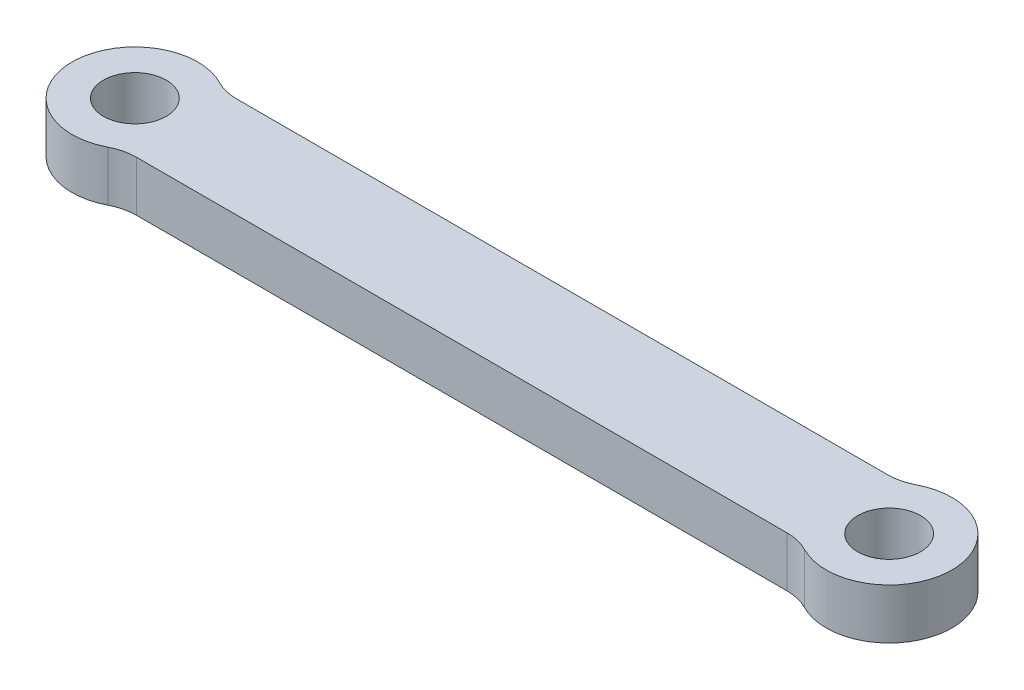
ISO-10303-21;
HEADER;
FILE_DESCRIPTION(('STEP AP214'),'2;1');
FILE_NAME('part.step','',(''),(''),'','','');
FILE_SCHEMA(('AUTOMOTIVE_DESIGN { 1 0 10303 214 1 1 1 1 }'));
ENDSEC;
DATA;
#1=APPLICATION_CONTEXT('core data for automotive mechanical design processes');
#2=APPLICATION_PROTOCOL_DEFINITION('international standard','automotive_design',2000,#1);
#3=PRODUCT_CONTEXT('',#1,'mechanical');
#4=PRODUCT('Part','Part','',(#3));
#5=PRODUCT_RELATED_PRODUCT_CATEGORY('part','',(#4));
#6=PRODUCT_DEFINITION_FORMATION('','',#4);
#7=PRODUCT_DEFINITION_CONTEXT('part definition',#1,'design');
#8=PRODUCT_DEFINITION('design','',#6,#7);
#9=PRODUCT_DEFINITION_SHAPE('','',#8);
#10=(LENGTH_UNIT() NAMED_UNIT(*) SI_UNIT(.MILLI.,.METRE.));
#11=(NAMED_UNIT(*) PLANE_ANGLE_UNIT() SI_UNIT($,.RADIAN.));
#12=(NAMED_UNIT(*) SI_UNIT($,.STERADIAN.) SOLID_ANGLE_UNIT());
#13=UNCERTAINTY_MEASURE_WITH_UNIT(LENGTH_MEASURE(1.E-05),#10,'distance_accuracy_value','');
#14=(GEOMETRIC_REPRESENTATION_CONTEXT(3) GLOBAL_UNCERTAINTY_ASSIGNED_CONTEXT((#13)) GLOBAL_UNIT_ASSIGNED_CONTEXT((#10,
#11,#12)) REPRESENTATION_CONTEXT('',''));
#15=CARTESIAN_POINT('',(0.,0.,0.));
#16=DIRECTION('',(0.,0.,1.));
#17=DIRECTION('',(1.,0.,0.));
#18=AXIS2_PLACEMENT_3D('',#15,#16,#17);
#19=CARTESIAN_POINT('',(0.,2.,-4.));
#20=DIRECTION('',(0.,0.,-1.));
#21=DIRECTION('',(-1.,0.,0.));
#22=AXIS2_PLACEMENT_3D('',#19,#20,#21);
#23=PLANE('',#22);
#24=DIRECTION('',(1.,0.,0.));
#25=VECTOR('',#24,1.);
#26=CARTESIAN_POINT('',(0.,-2.,-4.));
#27=LINE('',#26,#25);
#28=CARTESIAN_POINT('',(-25.8768943743823,-2.,-4.));
#29=VERTEX_POINT('',#28);
#30=CARTESIAN_POINT('',(25.8768943743823,-2.,-4.));
#31=VERTEX_POINT('',#30);
#32=EDGE_CURVE('E148',#29,#31,#27,.T.);
#33=ORIENTED_EDGE('',*,*,#32,.F.);
#34=DIRECTION('',(0.,-1.,0.));
#35=VECTOR('',#34,1.);
#36=CARTESIAN_POINT('',(-25.8768943743823,2.,-4.));
#37=LINE('',#36,#35);
#38=CARTESIAN_POINT('',(-25.8768943743823,2.,-4.));
#39=VERTEX_POINT('',#38);
#40=EDGE_CURVE('E11',#39,#29,#37,.T.);
#41=ORIENTED_EDGE('',*,*,#40,.F.);
#42=DIRECTION('',(1.,0.,0.));
#43=VECTOR('',#42,1.);
#44=CARTESIAN_POINT('',(0.,2.,-4.));
#45=LINE('',#44,#43);
#46=CARTESIAN_POINT('',(25.8768943743823,2.,-4.));
#47=VERTEX_POINT('',#46);
#48=EDGE_CURVE('E219',#39,#47,#45,.T.);
#49=ORIENTED_EDGE('',*,*,#48,.T.);
#50=DIRECTION('',(0.,-1.,0.));
#51=VECTOR('',#50,1.);
#52=CARTESIAN_POINT('',(25.8768943743823,2.,-4.));
#53=LINE('',#52,#51);
#54=EDGE_CURVE('E50',#47,#31,#53,.T.);
#55=ORIENTED_EDGE('',*,*,#54,.T.);
#56=EDGE_LOOP('',(#33,#41,#49,#55));
#57=FACE_BOUND('',#56,.T.);
#58=ADVANCED_FACE('F33',(#57),#23,.T.);
#59=CARTESIAN_POINT('',(-25.8768943743823,2.,-8.));
#60=DIRECTION('',(0.,-1.,0.));
#61=DIRECTION('',(0.,0.,-1.));
#62=AXIS2_PLACEMENT_3D('',#59,#60,#61);
#63=CYLINDRICAL_SURFACE('',#62,4.);
#64=CARTESIAN_POINT('',(-25.8768943743823,-2.,-8.));
#65=DIRECTION('',(0.,1.,0.));
#66=DIRECTION('',(0.,0.,1.));
#67=AXIS2_PLACEMENT_3D('',#64,#65,#66);
#68=CIRCLE('',#67,4.);
#69=CARTESIAN_POINT('',(-27.7093857635457,-2.,-4.44444444444444));
#70=VERTEX_POINT('',#69);
#71=EDGE_CURVE('E145',#29,#70,#68,.F.);
#72=ORIENTED_EDGE('',*,*,#71,.T.);
#73=DIRECTION('',(0.,-1.,0.));
#74=VECTOR('',#73,1.);
#75=CARTESIAN_POINT('',(-27.7093857635457,2.,-4.44444444444444));
#76=LINE('',#75,#74);
#77=CARTESIAN_POINT('',(-27.7093857635457,2.,-4.44444444444444));
#78=VERTEX_POINT('',#77);
#79=EDGE_CURVE('E42',#78,#70,#76,.T.);
#80=ORIENTED_EDGE('',*,*,#79,.F.);
#81=CARTESIAN_POINT('',(-25.8768943743823,2.,-8.));
#82=DIRECTION('',(0.,1.,0.));
#83=DIRECTION('',(0.,0.,1.));
#84=AXIS2_PLACEMENT_3D('',#81,#82,#83);
#85=CIRCLE('',#84,4.);
#86=EDGE_CURVE('E221',#39,#78,#85,.F.);
#87=ORIENTED_EDGE('',*,*,#86,.F.);
#88=ORIENTED_EDGE('',*,*,#40,.T.);
#89=EDGE_LOOP('',(#72,#80,#87,#88));
#90=FACE_BOUND('',#89,.T.);
#91=ADVANCED_FACE('F146',(#90),#63,.F.);
#92=CARTESIAN_POINT('',(-30.,2.,0.));
#93=DIRECTION('',(0.,-1.,0.));
#94=DIRECTION('',(0.,0.,-1.));
#95=AXIS2_PLACEMENT_3D('',#92,#93,#94);
#96=CYLINDRICAL_SURFACE('',#95,5.);
#97=CARTESIAN_POINT('',(-30.,-2.,0.));
#98=DIRECTION('',(0.,1.,0.));
#99=DIRECTION('',(0.,0.,1.));
#100=AXIS2_PLACEMENT_3D('',#97,#98,#99);
#101=CIRCLE('',#100,5.);
#102=CARTESIAN_POINT('',(-27.7093857635457,-2.,4.44444444444445));
#103=VERTEX_POINT('',#102);
#104=EDGE_CURVE('E139',#70,#103,#101,.T.);
#105=ORIENTED_EDGE('',*,*,#104,.T.);
#106=DIRECTION('',(0.,-1.,0.));
#107=VECTOR('',#106,1.);
#108=CARTESIAN_POINT('',(-27.7093857635457,2.,4.44444444444445));
#109=LINE('',#108,#107);
#110=CARTESIAN_POINT('',(-27.7093857635457,2.,4.44444444444445));
#111=VERTEX_POINT('',#110);
#112=EDGE_CURVE('E131',#111,#103,#109,.T.);
#113=ORIENTED_EDGE('',*,*,#112,.F.);
#114=CARTESIAN_POINT('',(-30.,2.,0.));
#115=DIRECTION('',(0.,1.,0.));
#116=DIRECTION('',(0.,0.,1.));
#117=AXIS2_PLACEMENT_3D('',#114,#115,#116);
#118=CIRCLE('',#117,5.);
#119=EDGE_CURVE('E141',#78,#111,#118,.T.);
#120=ORIENTED_EDGE('',*,*,#119,.F.);
#121=ORIENTED_EDGE('',*,*,#79,.T.);
#122=EDGE_LOOP('',(#105,#113,#120,#121));
#123=FACE_BOUND('',#122,.T.);
#124=ADVANCED_FACE('F137',(#123),#96,.T.);
#125=CARTESIAN_POINT('',(-25.8768943743823,2.,8.));
#126=DIRECTION('',(0.,-1.,0.));
#127=DIRECTION('',(0.,0.,-1.));
#128=AXIS2_PLACEMENT_3D('',#125,#126,#127);
#129=CYLINDRICAL_SURFACE('',#128,4.);
#130=CARTESIAN_POINT('',(-25.8768943743823,-2.,8.));
#131=DIRECTION('',(0.,1.,0.));
#132=DIRECTION('',(0.,0.,1.));
#133=AXIS2_PLACEMENT_3D('',#130,#131,#132);
#134=CIRCLE('',#133,4.);
#135=CARTESIAN_POINT('',(-25.8768943743823,-2.,4.));
#136=VERTEX_POINT('',#135);
#137=EDGE_CURVE('E150',#136,#103,#134,.T.);
#138=ORIENTED_EDGE('',*,*,#137,.F.);
#139=DIRECTION('',(0.,-1.,0.));
#140=VECTOR('',#139,1.);
#141=CARTESIAN_POINT('',(-25.8768943743823,2.,4.));
#142=LINE('',#141,#140);
#143=CARTESIAN_POINT('',(-25.8768943743823,2.,4.));
#144=VERTEX_POINT('',#143);
#145=EDGE_CURVE('E125',#144,#136,#142,.T.);
#146=ORIENTED_EDGE('',*,*,#145,.F.);
#147=CARTESIAN_POINT('',(-25.8768943743823,2.,8.));
#148=DIRECTION('',(0.,1.,0.));
#149=DIRECTION('',(0.,0.,1.));
#150=AXIS2_PLACEMENT_3D('',#147,#148,#149);
#151=CIRCLE('',#150,4.);
#152=EDGE_CURVE('E227',#144,#111,#151,.T.);
#153=ORIENTED_EDGE('',*,*,#152,.T.);
#154=ORIENTED_EDGE('',*,*,#112,.T.);
#155=EDGE_LOOP('',(#138,#146,#153,#154));
#156=FACE_BOUND('',#155,.T.);
#157=ADVANCED_FACE('F195',(#156),#129,.F.);
#158=CARTESIAN_POINT('',(0.,2.,4.));
#159=DIRECTION('',(0.,0.,-1.));
#160=DIRECTION('',(-1.,0.,0.));
#161=AXIS2_PLACEMENT_3D('',#158,#159,#160);
#162=PLANE('',#161);
#163=DIRECTION('',(1.,0.,0.));
#164=VECTOR('',#163,1.);
#165=CARTESIAN_POINT('',(0.,-2.,4.));
#166=LINE('',#165,#164);
#167=CARTESIAN_POINT('',(25.8768943743823,-2.,4.));
#168=VERTEX_POINT('',#167);
#169=EDGE_CURVE('E157',#136,#168,#166,.T.);
#170=ORIENTED_EDGE('',*,*,#169,.T.);
#171=DIRECTION('',(0.,-1.,0.));
#172=VECTOR('',#171,1.);
#173=CARTESIAN_POINT('',(25.8768943743823,2.,4.));
#174=LINE('',#173,#172);
#175=CARTESIAN_POINT('',(25.8768943743823,2.,4.));
#176=VERTEX_POINT('',#175);
#177=EDGE_CURVE('E123',#176,#168,#174,.T.);
#178=ORIENTED_EDGE('',*,*,#177,.F.);
#179=DIRECTION('',(1.,0.,0.));
#180=VECTOR('',#179,1.);
#181=CARTESIAN_POINT('',(0.,2.,4.));
#182=LINE('',#181,#180);
#183=EDGE_CURVE('E116',#144,#176,#182,.T.);
#184=ORIENTED_EDGE('',*,*,#183,.F.);
#185=ORIENTED_EDGE('',*,*,#145,.T.);
#186=EDGE_LOOP('',(#170,#178,#184,#185));
#187=FACE_BOUND('',#186,.T.);
#188=ADVANCED_FACE('F198',(#187),#162,.F.);
#189=CARTESIAN_POINT('',(25.8768943743823,2.,8.));
#190=DIRECTION('',(0.,-1.,0.));
#191=DIRECTION('',(0.,0.,-1.));
#192=AXIS2_PLACEMENT_3D('',#189,#190,#191);
#193=CYLINDRICAL_SURFACE('',#192,4.);
#194=CARTESIAN_POINT('',(25.8768943743823,-2.,8.));
#195=DIRECTION('',(0.,1.,0.));
#196=DIRECTION('',(0.,0.,1.));
#197=AXIS2_PLACEMENT_3D('',#194,#195,#196);
#198=CIRCLE('',#197,4.);
#199=CARTESIAN_POINT('',(27.7093857635457,-2.,4.44444444444444));
#200=VERTEX_POINT('',#199);
#201=EDGE_CURVE('E122',#168,#200,#198,.F.);
#202=ORIENTED_EDGE('',*,*,#201,.T.);
#203=DIRECTION('',(0.,-1.,0.));
#204=VECTOR('',#203,1.);
#205=CARTESIAN_POINT('',(27.7093857635457,2.,4.44444444444444));
#206=LINE('',#205,#204);
#207=CARTESIAN_POINT('',(27.7093857635457,2.,4.44444444444444));
#208=VERTEX_POINT('',#207);
#209=EDGE_CURVE('E104',#208,#200,#206,.T.);
#210=ORIENTED_EDGE('',*,*,#209,.F.);
#211=CARTESIAN_POINT('',(25.8768943743823,2.,8.));
#212=DIRECTION('',(0.,1.,0.));
#213=DIRECTION('',(0.,0.,1.));
#214=AXIS2_PLACEMENT_3D('',#211,#212,#213);
#215=CIRCLE('',#214,4.);
#216=EDGE_CURVE('E109',#176,#208,#215,.F.);
#217=ORIENTED_EDGE('',*,*,#216,.F.);
#218=ORIENTED_EDGE('',*,*,#177,.T.);
#219=EDGE_LOOP('',(#202,#210,#217,#218));
#220=FACE_BOUND('',#219,.T.);
#221=ADVANCED_FACE('F121',(#220),#193,.F.);
#222=CARTESIAN_POINT('',(30.,2.,0.));
#223=DIRECTION('',(0.,-1.,0.));
#224=DIRECTION('',(0.,0.,-1.));
#225=AXIS2_PLACEMENT_3D('',#222,#223,#224);
#226=CYLINDRICAL_SURFACE('',#225,5.);
#227=CARTESIAN_POINT('',(30.,-2.,0.));
#228=DIRECTION('',(0.,1.,0.));
#229=DIRECTION('',(0.,0.,1.));
#230=AXIS2_PLACEMENT_3D('',#227,#228,#229);
#231=CIRCLE('',#230,5.);
#232=CARTESIAN_POINT('',(27.7093857635457,-2.,-4.44444444444445));
#233=VERTEX_POINT('',#232);
#234=EDGE_CURVE('E161',#200,#233,#231,.T.);
#235=ORIENTED_EDGE('',*,*,#234,.T.);
#236=DIRECTION('',(0.,-1.,0.));
#237=VECTOR('',#236,1.);
#238=CARTESIAN_POINT('',(27.7093857635457,2.,-4.44444444444445));
#239=LINE('',#238,#237);
#240=CARTESIAN_POINT('',(27.7093857635457,2.,-4.44444444444445));
#241=VERTEX_POINT('',#240);
#242=EDGE_CURVE('E76',#241,#233,#239,.T.);
#243=ORIENTED_EDGE('',*,*,#242,.F.);
#244=CARTESIAN_POINT('',(30.,2.,0.));
#245=DIRECTION('',(0.,1.,0.));
#246=DIRECTION('',(0.,0.,1.));
#247=AXIS2_PLACEMENT_3D('',#244,#245,#246);
#248=CIRCLE('',#247,5.);
#249=EDGE_CURVE('E100',#208,#241,#248,.T.);
#250=ORIENTED_EDGE('',*,*,#249,.F.);
#251=ORIENTED_EDGE('',*,*,#209,.T.);
#252=EDGE_LOOP('',(#235,#243,#250,#251));
#253=FACE_BOUND('',#252,.T.);
#254=ADVANCED_FACE('F102',(#253),#226,.T.);
#255=CARTESIAN_POINT('',(30.,2.,0.));
#256=DIRECTION('',(0.,-1.,0.));
#257=DIRECTION('',(0.,0.,-1.));
#258=AXIS2_PLACEMENT_3D('',#255,#256,#257);
#259=CYLINDRICAL_SURFACE('',#258,2.5);
#260=CARTESIAN_POINT('',(30.,2.,0.));
#261=DIRECTION('',(0.,1.,0.));
#262=DIRECTION('',(0.,0.,1.));
#263=AXIS2_PLACEMENT_3D('',#260,#261,#262);
#264=CIRCLE('',#263,2.5);
#265=CARTESIAN_POINT('',(30.,2.,2.5));
#266=VERTEX_POINT('',#265);
#267=EDGE_CURVE('E218',#266,#266,#264,.T.);
#268=ORIENTED_EDGE('',*,*,#267,.T.);
#269=EDGE_LOOP('',(#268));
#270=FACE_BOUND('',#269,.T.);
#271=CARTESIAN_POINT('',(30.,-2.,0.));
#272=DIRECTION('',(0.,1.,0.));
#273=DIRECTION('',(0.,0.,1.));
#274=AXIS2_PLACEMENT_3D('',#271,#272,#273);
#275=CIRCLE('',#274,2.5);
#276=CARTESIAN_POINT('',(30.,-2.,2.5));
#277=VERTEX_POINT('',#276);
#278=EDGE_CURVE('E152',#277,#277,#275,.T.);
#279=ORIENTED_EDGE('',*,*,#278,.F.);
#280=EDGE_LOOP('',(#279));
#281=FACE_BOUND('',#280,.T.);
#282=ADVANCED_FACE('F175',(#270,#281),#259,.F.);
#283=CARTESIAN_POINT('',(-30.,2.,0.));
#284=DIRECTION('',(0.,-1.,0.));
#285=DIRECTION('',(0.,0.,-1.));
#286=AXIS2_PLACEMENT_3D('',#283,#284,#285);
#287=CYLINDRICAL_SURFACE('',#286,2.5);
#288=CARTESIAN_POINT('',(-30.,2.,0.));
#289=DIRECTION('',(0.,1.,0.));
#290=DIRECTION('',(0.,0.,1.));
#291=AXIS2_PLACEMENT_3D('',#288,#289,#290);
#292=CIRCLE('',#291,2.5);
#293=CARTESIAN_POINT('',(-30.,2.,2.5));
#294=VERTEX_POINT('',#293);
#295=EDGE_CURVE('E165',#294,#294,#292,.T.);
#296=ORIENTED_EDGE('',*,*,#295,.T.);
#297=EDGE_LOOP('',(#296));
#298=FACE_BOUND('',#297,.T.);
#299=CARTESIAN_POINT('',(-30.,-2.,0.));
#300=DIRECTION('',(0.,1.,0.));
#301=DIRECTION('',(0.,0.,1.));
#302=AXIS2_PLACEMENT_3D('',#299,#300,#301);
#303=CIRCLE('',#302,2.5);
#304=CARTESIAN_POINT('',(-30.,-2.,2.5));
#305=VERTEX_POINT('',#304);
#306=EDGE_CURVE('E168',#305,#305,#303,.T.);
#307=ORIENTED_EDGE('',*,*,#306,.F.);
#308=EDGE_LOOP('',(#307));
#309=FACE_BOUND('',#308,.T.);
#310=ADVANCED_FACE('F35',(#298,#309),#287,.F.);
#311=CARTESIAN_POINT('',(25.8768943743823,2.,-8.));
#312=DIRECTION('',(0.,-1.,0.));
#313=DIRECTION('',(0.,0.,-1.));
#314=AXIS2_PLACEMENT_3D('',#311,#312,#313);
#315=CYLINDRICAL_SURFACE('',#314,4.);
#316=CARTESIAN_POINT('',(25.8768943743823,-2.,-8.));
#317=DIRECTION('',(0.,1.,0.));
#318=DIRECTION('',(0.,0.,1.));
#319=AXIS2_PLACEMENT_3D('',#316,#317,#318);
#320=CIRCLE('',#319,4.);
#321=EDGE_CURVE('E163',#31,#233,#320,.T.);
#322=ORIENTED_EDGE('',*,*,#321,.F.);
#323=ORIENTED_EDGE('',*,*,#54,.F.);
#324=CARTESIAN_POINT('',(25.8768943743823,2.,-8.));
#325=DIRECTION('',(0.,1.,0.));
#326=DIRECTION('',(0.,0.,1.));
#327=AXIS2_PLACEMENT_3D('',#324,#325,#326);
#328=CIRCLE('',#327,4.);
#329=EDGE_CURVE('E108',#47,#241,#328,.T.);
#330=ORIENTED_EDGE('',*,*,#329,.T.);
#331=ORIENTED_EDGE('',*,*,#242,.T.);
#332=EDGE_LOOP('',(#322,#323,#330,#331));
#333=FACE_BOUND('',#332,.T.);
#334=ADVANCED_FACE('F182',(#333),#315,.F.);
#335=CARTESIAN_POINT('',(0.,2.,0.));
#336=DIRECTION('',(0.,1.,0.));
#337=DIRECTION('',(0.,0.,1.));
#338=AXIS2_PLACEMENT_3D('',#335,#336,#337);
#339=PLANE('',#338);
#340=ORIENTED_EDGE('',*,*,#295,.F.);
#341=EDGE_LOOP('',(#340));
#342=FACE_BOUND('',#341,.T.);
#343=ORIENTED_EDGE('',*,*,#267,.F.);
#344=EDGE_LOOP('',(#343));
#345=FACE_BOUND('',#344,.T.);
#346=ORIENTED_EDGE('',*,*,#48,.F.);
#347=ORIENTED_EDGE('',*,*,#86,.T.);
#348=ORIENTED_EDGE('',*,*,#119,.T.);
#349=ORIENTED_EDGE('',*,*,#152,.F.);
#350=ORIENTED_EDGE('',*,*,#183,.T.);
#351=ORIENTED_EDGE('',*,*,#216,.T.);
#352=ORIENTED_EDGE('',*,*,#249,.T.);
#353=ORIENTED_EDGE('',*,*,#329,.F.);
#354=EDGE_LOOP('',(#346,#347,#348,#349,#350,#351,#352,#353));
#355=FACE_BOUND('',#354,.T.);
#356=ADVANCED_FACE('F113',(#342,#345,#355),#339,.T.);
#357=CARTESIAN_POINT('',(0.,-2.,0.));
#358=DIRECTION('',(0.,1.,0.));
#359=DIRECTION('',(0.,0.,1.));
#360=AXIS2_PLACEMENT_3D('',#357,#358,#359);
#361=PLANE('',#360);
#362=ORIENTED_EDGE('',*,*,#306,.T.);
#363=EDGE_LOOP('',(#362));
#364=FACE_BOUND('',#363,.T.);
#365=ORIENTED_EDGE('',*,*,#278,.T.);
#366=EDGE_LOOP('',(#365));
#367=FACE_BOUND('',#366,.T.);
#368=ORIENTED_EDGE('',*,*,#32,.T.);
#369=ORIENTED_EDGE('',*,*,#321,.T.);
#370=ORIENTED_EDGE('',*,*,#234,.F.);
#371=ORIENTED_EDGE('',*,*,#201,.F.);
#372=ORIENTED_EDGE('',*,*,#169,.F.);
#373=ORIENTED_EDGE('',*,*,#137,.T.);
#374=ORIENTED_EDGE('',*,*,#104,.F.);
#375=ORIENTED_EDGE('',*,*,#71,.F.);
#376=EDGE_LOOP('',(#368,#369,#370,#371,#372,#373,#374,#375));
#377=FACE_BOUND('',#376,.T.);
#378=ADVANCED_FACE('F173',(#364,#367,#377),#361,.F.);
#379=CLOSED_SHELL('',(#58,#91,#124,#157,#188,#221,#254,#282,#310,#334,#356,#378));
#380=MANIFOLD_SOLID_BREP('B2',#379);
#381=ADVANCED_BREP_SHAPE_REPRESENTATION('',(#18,#380),#14);
#382=SHAPE_DEFINITION_REPRESENTATION(#9,#381);
ENDSEC;
END-ISO-10303-21;
